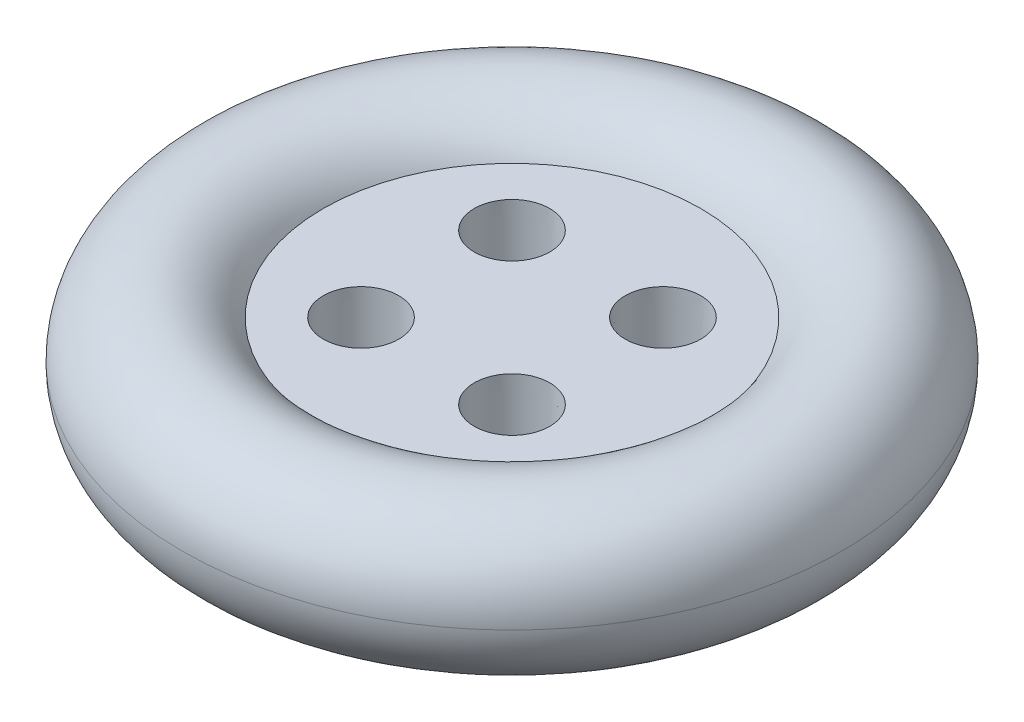
ISO-10303-21;
HEADER;
FILE_DESCRIPTION(('STEP AP214'),'2;1');
FILE_NAME('part.step','',(''),(''),'','','');
FILE_SCHEMA(('AUTOMOTIVE_DESIGN { 1 0 10303 214 1 1 1 1 }'));
ENDSEC;
DATA;
#1=APPLICATION_CONTEXT('core data for automotive mechanical design processes');
#2=APPLICATION_PROTOCOL_DEFINITION('international standard','automotive_design',2000,#1);
#3=PRODUCT_CONTEXT('',#1,'mechanical');
#4=PRODUCT('Part','Part','',(#3));
#5=PRODUCT_RELATED_PRODUCT_CATEGORY('part','',(#4));
#6=PRODUCT_DEFINITION_FORMATION('','',#4);
#7=PRODUCT_DEFINITION_CONTEXT('part definition',#1,'design');
#8=PRODUCT_DEFINITION('design','',#6,#7);
#9=PRODUCT_DEFINITION_SHAPE('','',#8);
#10=(LENGTH_UNIT() NAMED_UNIT(*) SI_UNIT(.MILLI.,.METRE.));
#11=(NAMED_UNIT(*) PLANE_ANGLE_UNIT() SI_UNIT($,.RADIAN.));
#12=(NAMED_UNIT(*) SI_UNIT($,.STERADIAN.) SOLID_ANGLE_UNIT());
#13=UNCERTAINTY_MEASURE_WITH_UNIT(LENGTH_MEASURE(1.E-05),#10,'distance_accuracy_value','');
#14=(GEOMETRIC_REPRESENTATION_CONTEXT(3) GLOBAL_UNCERTAINTY_ASSIGNED_CONTEXT((#13)) GLOBAL_UNIT_ASSIGNED_CONTEXT((#10,
#11,#12)) REPRESENTATION_CONTEXT('',''));
#15=CARTESIAN_POINT('',(0.,0.,0.));
#16=DIRECTION('',(0.,0.,1.));
#17=DIRECTION('',(1.,0.,0.));
#18=AXIS2_PLACEMENT_3D('',#15,#16,#17);
#19=CARTESIAN_POINT('',(0.,4.,0.));
#20=DIRECTION('',(0.,-1.,0.));
#21=DIRECTION('',(0.,0.,-1.));
#22=AXIS2_PLACEMENT_3D('',#19,#20,#21);
#23=TOROIDAL_SURFACE('',#22,26.9282032302755,8.);
#24=CARTESIAN_POINT('',(0.,0.,0.));
#25=DIRECTION('',(0.,-1.,0.));
#26=DIRECTION('',(0.,0.,-1.));
#27=AXIS2_PLACEMENT_3D('',#24,#25,#26);
#28=CIRCLE('',#27,20.);
#29=CARTESIAN_POINT('',(0.,0.,-20.));
#30=VERTEX_POINT('',#29);
#31=EDGE_CURVE('E55',#30,#30,#28,.T.);
#32=ORIENTED_EDGE('',*,*,#31,.F.);
#33=EDGE_LOOP('',(#32));
#34=FACE_BOUND('',#33,.T.);
#35=CARTESIAN_POINT('',(0.,4.,0.));
#36=DIRECTION('',(0.,-1.,0.));
#37=DIRECTION('',(0.,0.,-1.));
#38=AXIS2_PLACEMENT_3D('',#35,#36,#37);
#39=CIRCLE('',#38,34.9282032302755);
#40=CARTESIAN_POINT('',(0.,4.,-34.9282032302755));
#41=VERTEX_POINT('',#40);
#42=EDGE_CURVE('E10',#41,#41,#39,.T.);
#43=ORIENTED_EDGE('',*,*,#42,.T.);
#44=EDGE_LOOP('',(#43));
#45=FACE_BOUND('',#44,.T.);
#46=ADVANCED_FACE('F42',(#34,#45),#23,.T.);
#47=CARTESIAN_POINT('',(0.,8.,0.));
#48=DIRECTION('',(0.,1.,0.));
#49=DIRECTION('',(0.,0.,1.));
#50=AXIS2_PLACEMENT_3D('',#47,#48,#49);
#51=PLANE('',#50);
#52=CARTESIAN_POINT('',(-8.00000000000008,8.,7.99999999999992));
#53=DIRECTION('',(0.,1.,0.));
#54=DIRECTION('',(0.,0.,1.));
#55=AXIS2_PLACEMENT_3D('',#52,#53,#54);
#56=CIRCLE('',#55,4.);
#57=CARTESIAN_POINT('',(-8.00000000000008,8.,11.9999999999999));
#58=VERTEX_POINT('',#57);
#59=EDGE_CURVE('E197',#58,#58,#56,.T.);
#60=ORIENTED_EDGE('',*,*,#59,.F.);
#61=EDGE_LOOP('',(#60));
#62=FACE_BOUND('',#61,.T.);
#63=CARTESIAN_POINT('',(7.99999999999994,8.,8.00000000000005));
#64=DIRECTION('',(0.,1.,0.));
#65=DIRECTION('',(0.,0.,1.));
#66=AXIS2_PLACEMENT_3D('',#63,#64,#65);
#67=CIRCLE('',#66,4.);
#68=CARTESIAN_POINT('',(7.99999999999994,8.,12.0000000000001));
#69=VERTEX_POINT('',#68);
#70=EDGE_CURVE('E199',#69,#69,#67,.T.);
#71=ORIENTED_EDGE('',*,*,#70,.F.);
#72=EDGE_LOOP('',(#71));
#73=FACE_BOUND('',#72,.T.);
#74=CARTESIAN_POINT('',(8.00000000000002,8.,-7.99999999999997));
#75=DIRECTION('',(0.,1.,0.));
#76=DIRECTION('',(0.,0.,1.));
#77=AXIS2_PLACEMENT_3D('',#74,#75,#76);
#78=CIRCLE('',#77,4.);
#79=CARTESIAN_POINT('',(8.00000000000002,8.,-3.99999999999997));
#80=VERTEX_POINT('',#79);
#81=EDGE_CURVE('E203',#80,#80,#78,.T.);
#82=ORIENTED_EDGE('',*,*,#81,.F.);
#83=EDGE_LOOP('',(#82));
#84=FACE_BOUND('',#83,.T.);
#85=CARTESIAN_POINT('',(-8.,8.,-8.));
#86=DIRECTION('',(0.,1.,0.));
#87=DIRECTION('',(0.,0.,1.));
#88=AXIS2_PLACEMENT_3D('',#85,#86,#87);
#89=CIRCLE('',#88,4.);
#90=CARTESIAN_POINT('',(-8.,8.,-4.));
#91=VERTEX_POINT('',#90);
#92=EDGE_CURVE('E76',#91,#91,#89,.T.);
#93=ORIENTED_EDGE('',*,*,#92,.F.);
#94=EDGE_LOOP('',(#93));
#95=FACE_BOUND('',#94,.T.);
#96=CARTESIAN_POINT('',(0.,8.,0.));
#97=DIRECTION('',(0.,-1.,0.));
#98=DIRECTION('',(0.,0.,-1.));
#99=AXIS2_PLACEMENT_3D('',#96,#97,#98);
#100=CIRCLE('',#99,20.);
#101=CARTESIAN_POINT('',(0.,8.,-20.));
#102=VERTEX_POINT('',#101);
#103=EDGE_CURVE('E50',#102,#102,#100,.T.);
#104=ORIENTED_EDGE('',*,*,#103,.F.);
#105=EDGE_LOOP('',(#104));
#106=FACE_BOUND('',#105,.T.);
#107=ADVANCED_FACE('F96',(#62,#73,#84,#95,#106),#51,.T.);
#108=ORIENTED_EDGE('',*,*,#42,.F.);
#109=EDGE_LOOP('',(#108));
#110=FACE_BOUND('',#109,.T.);
#111=ORIENTED_EDGE('',*,*,#103,.T.);
#112=EDGE_LOOP('',(#111));
#113=FACE_BOUND('',#112,.T.);
#114=ADVANCED_FACE('F88',(#110,#113),#23,.T.);
#115=CARTESIAN_POINT('',(0.,0.,0.));
#116=DIRECTION('',(0.,-1.,0.));
#117=DIRECTION('',(0.,0.,-1.));
#118=AXIS2_PLACEMENT_3D('',#115,#116,#117);
#119=PLANE('',#118);
#120=CARTESIAN_POINT('',(-8.00000000000008,0.,7.99999999999992));
#121=DIRECTION('',(0.,-1.,0.));
#122=DIRECTION('',(0.,0.,-1.));
#123=AXIS2_PLACEMENT_3D('',#120,#121,#122);
#124=CIRCLE('',#123,3.86035948057426);
#125=CARTESIAN_POINT('',(-8.00000000000008,0.,4.13964051942566));
#126=VERTEX_POINT('',#125);
#127=EDGE_CURVE('E61',#126,#126,#124,.T.);
#128=ORIENTED_EDGE('',*,*,#127,.F.);
#129=EDGE_LOOP('',(#128));
#130=FACE_BOUND('',#129,.T.);
#131=CARTESIAN_POINT('',(7.99999999999994,0.,8.00000000000005));
#132=DIRECTION('',(0.,-1.,0.));
#133=DIRECTION('',(0.,0.,-1.));
#134=AXIS2_PLACEMENT_3D('',#131,#132,#133);
#135=CIRCLE('',#134,3.86035948057426);
#136=CARTESIAN_POINT('',(7.99999999999994,0.,4.13964051942579));
#137=VERTEX_POINT('',#136);
#138=EDGE_CURVE('E65',#137,#137,#135,.T.);
#139=ORIENTED_EDGE('',*,*,#138,.F.);
#140=EDGE_LOOP('',(#139));
#141=FACE_BOUND('',#140,.T.);
#142=CARTESIAN_POINT('',(8.00000000000002,0.,-7.99999999999997));
#143=DIRECTION('',(0.,-1.,0.));
#144=DIRECTION('',(0.,0.,-1.));
#145=AXIS2_PLACEMENT_3D('',#142,#143,#144);
#146=CIRCLE('',#145,3.86035948057426);
#147=CARTESIAN_POINT('',(8.00000000000002,0.,-11.8603594805742));
#148=VERTEX_POINT('',#147);
#149=EDGE_CURVE('E69',#148,#148,#146,.T.);
#150=ORIENTED_EDGE('',*,*,#149,.F.);
#151=EDGE_LOOP('',(#150));
#152=FACE_BOUND('',#151,.T.);
#153=CARTESIAN_POINT('',(-8.,0.,-8.));
#154=DIRECTION('',(0.,-1.,0.));
#155=DIRECTION('',(0.,0.,-1.));
#156=AXIS2_PLACEMENT_3D('',#153,#154,#155);
#157=CIRCLE('',#156,3.86035948057426);
#158=CARTESIAN_POINT('',(-8.,0.,-11.8603594805743));
#159=VERTEX_POINT('',#158);
#160=EDGE_CURVE('E73',#159,#159,#157,.T.);
#161=ORIENTED_EDGE('',*,*,#160,.F.);
#162=EDGE_LOOP('',(#161));
#163=FACE_BOUND('',#162,.T.);
#164=ORIENTED_EDGE('',*,*,#31,.T.);
#165=EDGE_LOOP('',(#164));
#166=FACE_BOUND('',#165,.T.);
#167=ADVANCED_FACE('F84',(#130,#141,#152,#163,#166),#119,.T.);
#168=CARTESIAN_POINT('',(-8.,8.,-8.));
#169=DIRECTION('',(0.,1.,0.));
#170=DIRECTION('',(0.,0.,1.));
#171=AXIS2_PLACEMENT_3D('',#168,#169,#170);
#172=CONICAL_SURFACE('',#171,4.,0.0174532925199433);
#173=ORIENTED_EDGE('',*,*,#160,.T.);
#174=EDGE_LOOP('',(#173));
#175=FACE_BOUND('',#174,.T.);
#176=ORIENTED_EDGE('',*,*,#92,.T.);
#177=EDGE_LOOP('',(#176));
#178=FACE_BOUND('',#177,.T.);
#179=ADVANCED_FACE('F87',(#175,#178),#172,.F.);
#180=CARTESIAN_POINT('',(8.00000000000002,8.,-7.99999999999997));
#181=DIRECTION('',(0.,1.,0.));
#182=DIRECTION('',(0.,0.,1.));
#183=AXIS2_PLACEMENT_3D('',#180,#181,#182);
#184=CONICAL_SURFACE('',#183,4.,0.0174532925199433);
#185=ORIENTED_EDGE('',*,*,#149,.T.);
#186=EDGE_LOOP('',(#185));
#187=FACE_BOUND('',#186,.T.);
#188=ORIENTED_EDGE('',*,*,#81,.T.);
#189=EDGE_LOOP('',(#188));
#190=FACE_BOUND('',#189,.T.);
#191=ADVANCED_FACE('F81',(#187,#190),#184,.F.);
#192=CARTESIAN_POINT('',(7.99999999999994,8.,8.00000000000005));
#193=DIRECTION('',(0.,1.,0.));
#194=DIRECTION('',(0.,0.,1.));
#195=AXIS2_PLACEMENT_3D('',#192,#193,#194);
#196=CONICAL_SURFACE('',#195,4.,0.0174532925199433);
#197=ORIENTED_EDGE('',*,*,#138,.T.);
#198=EDGE_LOOP('',(#197));
#199=FACE_BOUND('',#198,.T.);
#200=ORIENTED_EDGE('',*,*,#70,.T.);
#201=EDGE_LOOP('',(#200));
#202=FACE_BOUND('',#201,.T.);
#203=ADVANCED_FACE('F128',(#199,#202),#196,.F.);
#204=CARTESIAN_POINT('',(-8.00000000000008,8.,7.99999999999992));
#205=DIRECTION('',(0.,1.,0.));
#206=DIRECTION('',(0.,0.,1.));
#207=AXIS2_PLACEMENT_3D('',#204,#205,#206);
#208=CONICAL_SURFACE('',#207,4.,0.0174532925199433);
#209=ORIENTED_EDGE('',*,*,#127,.T.);
#210=EDGE_LOOP('',(#209));
#211=FACE_BOUND('',#210,.T.);
#212=ORIENTED_EDGE('',*,*,#59,.T.);
#213=EDGE_LOOP('',(#212));
#214=FACE_BOUND('',#213,.T.);
#215=ADVANCED_FACE('F44',(#211,#214),#208,.F.);
#216=CLOSED_SHELL('',(#46,#107,#114,#167,#179,#191,#203,#215));
#217=MANIFOLD_SOLID_BREP('B2',#216);
#218=ADVANCED_BREP_SHAPE_REPRESENTATION('',(#18,#217),#14);
#219=SHAPE_DEFINITION_REPRESENTATION(#9,#218);
ENDSEC;
END-ISO-10303-21;
